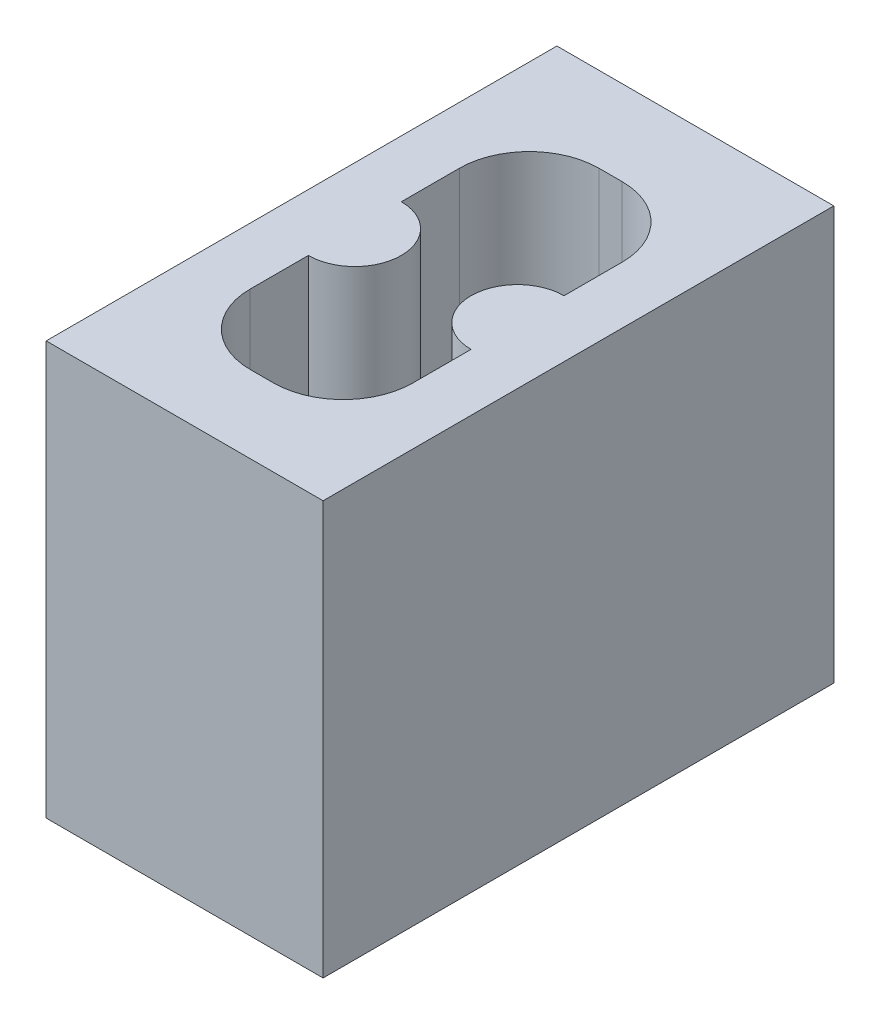
ISO-10303-21;
HEADER;
FILE_DESCRIPTION(('STEP AP214'),'2;1');
FILE_NAME('part.step','',(''),(''),'','','');
FILE_SCHEMA(('AUTOMOTIVE_DESIGN { 1 0 10303 214 1 1 1 1 }'));
ENDSEC;
DATA;
#1=APPLICATION_CONTEXT('core data for automotive mechanical design processes');
#2=APPLICATION_PROTOCOL_DEFINITION('international standard','automotive_design',2000,#1);
#3=PRODUCT_CONTEXT('',#1,'mechanical');
#4=PRODUCT('Part','Part','',(#3));
#5=PRODUCT_RELATED_PRODUCT_CATEGORY('part','',(#4));
#6=PRODUCT_DEFINITION_FORMATION('','',#4);
#7=PRODUCT_DEFINITION_CONTEXT('part definition',#1,'design');
#8=PRODUCT_DEFINITION('design','',#6,#7);
#9=PRODUCT_DEFINITION_SHAPE('','',#8);
#10=(LENGTH_UNIT() NAMED_UNIT(*) SI_UNIT(.MILLI.,.METRE.));
#11=(NAMED_UNIT(*) PLANE_ANGLE_UNIT() SI_UNIT($,.RADIAN.));
#12=(NAMED_UNIT(*) SI_UNIT($,.STERADIAN.) SOLID_ANGLE_UNIT());
#13=UNCERTAINTY_MEASURE_WITH_UNIT(LENGTH_MEASURE(1.E-05),#10,'distance_accuracy_value','');
#14=(GEOMETRIC_REPRESENTATION_CONTEXT(3) GLOBAL_UNCERTAINTY_ASSIGNED_CONTEXT((#13)) GLOBAL_UNIT_ASSIGNED_CONTEXT((#10,
#11,#12)) REPRESENTATION_CONTEXT('',''));
#15=CARTESIAN_POINT('',(0.,0.,0.));
#16=DIRECTION('',(0.,0.,1.));
#17=DIRECTION('',(1.,0.,0.));
#18=AXIS2_PLACEMENT_3D('',#15,#16,#17);
#19=CARTESIAN_POINT('',(0.509999421629871,17.79,-7.33613194140708));
#20=DIRECTION('',(0.,0.,1.));
#21=DIRECTION('',(-1.,0.,0.));
#22=AXIS2_PLACEMENT_3D('',#19,#20,#21);
#23=PLANE('',#22);
#24=DIRECTION('',(1.,0.,0.));
#25=VECTOR('',#24,1.);
#26=CARTESIAN_POINT('',(-5.78370315182375E-07,0.,-7.33613194140708));
#27=LINE('',#26,#25);
#28=CARTESIAN_POINT('',(-0.500000578370261,0.,-7.33613194140708));
#29=VERTEX_POINT('',#28);
#30=CARTESIAN_POINT('',(0.499999421629738,0.,-7.33613194140708));
#31=VERTEX_POINT('',#30);
#32=EDGE_CURVE('E190',#29,#31,#27,.T.);
#33=ORIENTED_EDGE('',*,*,#32,.T.);
#34=DIRECTION('',(0.,-1.,0.));
#35=VECTOR('',#34,1.);
#36=CARTESIAN_POINT('',(0.499999421629811,8.89000000000001,-7.33613194140708));
#37=LINE('',#36,#35);
#38=CARTESIAN_POINT('',(0.499999421629873,17.78,-7.33613194140708));
#39=VERTEX_POINT('',#38);
#40=EDGE_CURVE('E171',#39,#31,#37,.T.);
#41=ORIENTED_EDGE('',*,*,#40,.F.);
#42=DIRECTION('',(-1.,0.,0.));
#43=VECTOR('',#42,1.);
#44=CARTESIAN_POINT('',(-5.78370190824386E-07,17.78,-7.33613194140708));
#45=LINE('',#44,#43);
#46=CARTESIAN_POINT('',(-0.500000578370128,17.78,-7.33613194140708));
#47=VERTEX_POINT('',#46);
#48=EDGE_CURVE('E192',#39,#47,#45,.T.);
#49=ORIENTED_EDGE('',*,*,#48,.T.);
#50=DIRECTION('',(0.,1.,0.));
#51=VECTOR('',#50,1.);
#52=CARTESIAN_POINT('',(-0.50000057837019,8.89,-7.33613194140708));
#53=LINE('',#52,#51);
#54=EDGE_CURVE('E160',#29,#47,#53,.T.);
#55=ORIENTED_EDGE('',*,*,#54,.F.);
#56=EDGE_LOOP('',(#33,#41,#49,#55));
#57=FACE_BOUND('',#56,.T.);
#58=ADVANCED_FACE('F16',(#57),#23,.T.);
#59=CARTESIAN_POINT('',(-0.510000578370131,17.79,7.66386805859292));
#60=DIRECTION('',(0.,0.,-1.));
#61=DIRECTION('',(1.,0.,0.));
#62=AXIS2_PLACEMENT_3D('',#59,#60,#61);
#63=PLANE('',#62);
#64=DIRECTION('',(-1.,0.,0.));
#65=VECTOR('',#64,1.);
#66=CARTESIAN_POINT('',(-5.78370255442835E-07,0.,7.66386805859289));
#67=LINE('',#66,#65);
#68=CARTESIAN_POINT('',(0.499999421629808,0.,7.66386805859289));
#69=VERTEX_POINT('',#68);
#70=CARTESIAN_POINT('',(-0.500000578370266,0.,7.66386805859289));
#71=VERTEX_POINT('',#70);
#72=EDGE_CURVE('E188',#69,#71,#67,.T.);
#73=ORIENTED_EDGE('',*,*,#72,.T.);
#74=DIRECTION('',(0.,-1.,0.));
#75=VECTOR('',#74,1.);
#76=CARTESIAN_POINT('',(-0.500000578370194,8.88999999999999,7.66386805859291));
#77=LINE('',#76,#75);
#78=CARTESIAN_POINT('',(-0.500000578370133,17.78,7.66386805859292));
#79=VERTEX_POINT('',#78);
#80=EDGE_CURVE('E162',#79,#71,#77,.T.);
#81=ORIENTED_EDGE('',*,*,#80,.F.);
#82=DIRECTION('',(-1.,0.,0.));
#83=VECTOR('',#82,1.);
#84=CARTESIAN_POINT('',(0.,17.78,7.66386805859292));
#85=LINE('',#84,#83);
#86=CARTESIAN_POINT('',(0.499999421629871,17.78,7.66386805859292));
#87=VERTEX_POINT('',#86);
#88=EDGE_CURVE('E221',#87,#79,#85,.T.);
#89=ORIENTED_EDGE('',*,*,#88,.F.);
#90=DIRECTION('',(0.,1.,0.));
#91=VECTOR('',#90,1.);
#92=CARTESIAN_POINT('',(0.499999421629808,8.89,7.66386805859291));
#93=LINE('',#92,#91);
#94=EDGE_CURVE('E159',#69,#87,#93,.T.);
#95=ORIENTED_EDGE('',*,*,#94,.F.);
#96=EDGE_LOOP('',(#73,#81,#89,#95));
#97=FACE_BOUND('',#96,.T.);
#98=ADVANCED_FACE('F264',(#97),#63,.T.);
#99=CARTESIAN_POINT('',(5.96630000000001,-0.01,-10.9855));
#100=DIRECTION('',(0.,0.,-1.));
#101=DIRECTION('',(-1.,0.,0.));
#102=AXIS2_PLACEMENT_3D('',#99,#100,#101);
#103=PLANE('',#102);
#104=DIRECTION('',(-1.,0.,0.));
#105=VECTOR('',#104,1.);
#106=CARTESIAN_POINT('',(0.,17.78,-10.9855));
#107=LINE('',#106,#105);
#108=CARTESIAN_POINT('',(5.9563,17.78,-10.9855));
#109=VERTEX_POINT('',#108);
#110=CARTESIAN_POINT('',(-5.9563,17.78,-10.9855));
#111=VERTEX_POINT('',#110);
#112=EDGE_CURVE('E150',#109,#111,#107,.T.);
#113=ORIENTED_EDGE('',*,*,#112,.F.);
#114=DIRECTION('',(0.,1.,0.));
#115=VECTOR('',#114,1.);
#116=CARTESIAN_POINT('',(5.9563,8.88999999999999,-10.9855));
#117=LINE('',#116,#115);
#118=CARTESIAN_POINT('',(5.9563,0.,-10.9855));
#119=VERTEX_POINT('',#118);
#120=EDGE_CURVE('E185',#119,#109,#117,.T.);
#121=ORIENTED_EDGE('',*,*,#120,.F.);
#122=DIRECTION('',(1.,0.,0.));
#123=VECTOR('',#122,1.);
#124=CARTESIAN_POINT('',(0.,0.,-10.9855));
#125=LINE('',#124,#123);
#126=CARTESIAN_POINT('',(-5.9563,0.,-10.9855));
#127=VERTEX_POINT('',#126);
#128=EDGE_CURVE('E165',#127,#119,#125,.T.);
#129=ORIENTED_EDGE('',*,*,#128,.F.);
#130=DIRECTION('',(0.,-1.,0.));
#131=VECTOR('',#130,1.);
#132=CARTESIAN_POINT('',(-5.9563,8.88999999999999,-10.9855));
#133=LINE('',#132,#131);
#134=EDGE_CURVE('E122',#111,#127,#133,.T.);
#135=ORIENTED_EDGE('',*,*,#134,.F.);
#136=EDGE_LOOP('',(#113,#121,#129,#135));
#137=FACE_BOUND('',#136,.T.);
#138=ADVANCED_FACE('F409',(#137),#103,.T.);
#139=CARTESIAN_POINT('',(5.9563,-0.01,10.9955));
#140=DIRECTION('',(1.,0.,0.));
#141=DIRECTION('',(0.,0.,-1.));
#142=AXIS2_PLACEMENT_3D('',#139,#140,#141);
#143=PLANE('',#142);
#144=DIRECTION('',(0.,0.,-1.));
#145=VECTOR('',#144,1.);
#146=CARTESIAN_POINT('',(5.9563,17.78,0.));
#147=LINE('',#146,#145);
#148=CARTESIAN_POINT('',(5.9563,17.78,10.9855));
#149=VERTEX_POINT('',#148);
#150=EDGE_CURVE('E138',#149,#109,#147,.T.);
#151=ORIENTED_EDGE('',*,*,#150,.F.);
#152=DIRECTION('',(0.,1.,0.));
#153=VECTOR('',#152,1.);
#154=CARTESIAN_POINT('',(5.9563,8.88999999999999,10.9855));
#155=LINE('',#154,#153);
#156=CARTESIAN_POINT('',(5.9563,0.,10.9855));
#157=VERTEX_POINT('',#156);
#158=EDGE_CURVE('E182',#157,#149,#155,.T.);
#159=ORIENTED_EDGE('',*,*,#158,.F.);
#160=DIRECTION('',(0.,0.,1.));
#161=VECTOR('',#160,1.);
#162=CARTESIAN_POINT('',(5.9563,0.,0.));
#163=LINE('',#162,#161);
#164=EDGE_CURVE('E236',#119,#157,#163,.T.);
#165=ORIENTED_EDGE('',*,*,#164,.F.);
#166=ORIENTED_EDGE('',*,*,#120,.T.);
#167=EDGE_LOOP('',(#151,#159,#165,#166));
#168=FACE_BOUND('',#167,.T.);
#169=ADVANCED_FACE('F400',(#168),#143,.T.);
#170=CARTESIAN_POINT('',(-5.96630000000001,-0.01,10.9855));
#171=DIRECTION('',(0.,0.,1.));
#172=DIRECTION('',(1.,0.,0.));
#173=AXIS2_PLACEMENT_3D('',#170,#171,#172);
#174=PLANE('',#173);
#175=DIRECTION('',(1.,0.,0.));
#176=VECTOR('',#175,1.);
#177=CARTESIAN_POINT('',(0.,17.78,10.9855));
#178=LINE('',#177,#176);
#179=CARTESIAN_POINT('',(-5.9563,17.78,10.9855));
#180=VERTEX_POINT('',#179);
#181=EDGE_CURVE('E141',#180,#149,#178,.T.);
#182=ORIENTED_EDGE('',*,*,#181,.F.);
#183=DIRECTION('',(0.,1.,0.));
#184=VECTOR('',#183,1.);
#185=CARTESIAN_POINT('',(-5.9563,8.88999999999999,10.9855));
#186=LINE('',#185,#184);
#187=CARTESIAN_POINT('',(-5.9563,0.,10.9855));
#188=VERTEX_POINT('',#187);
#189=EDGE_CURVE('E179',#188,#180,#186,.T.);
#190=ORIENTED_EDGE('',*,*,#189,.F.);
#191=DIRECTION('',(-1.,0.,0.));
#192=VECTOR('',#191,1.);
#193=CARTESIAN_POINT('',(0.,0.,10.9855));
#194=LINE('',#193,#192);
#195=EDGE_CURVE('E239',#157,#188,#194,.T.);
#196=ORIENTED_EDGE('',*,*,#195,.F.);
#197=ORIENTED_EDGE('',*,*,#158,.T.);
#198=EDGE_LOOP('',(#182,#190,#196,#197));
#199=FACE_BOUND('',#198,.T.);
#200=ADVANCED_FACE('F391',(#199),#174,.T.);
#201=CARTESIAN_POINT('',(-5.9563,-0.01,-10.9955));
#202=DIRECTION('',(-1.,0.,0.));
#203=DIRECTION('',(0.,0.,1.));
#204=AXIS2_PLACEMENT_3D('',#201,#202,#203);
#205=PLANE('',#204);
#206=DIRECTION('',(0.,0.,1.));
#207=VECTOR('',#206,1.);
#208=CARTESIAN_POINT('',(-5.9563,17.78,0.));
#209=LINE('',#208,#207);
#210=EDGE_CURVE('E147',#111,#180,#209,.T.);
#211=ORIENTED_EDGE('',*,*,#210,.F.);
#212=ORIENTED_EDGE('',*,*,#134,.T.);
#213=DIRECTION('',(0.,0.,-1.));
#214=VECTOR('',#213,1.);
#215=CARTESIAN_POINT('',(-5.9563,0.,0.));
#216=LINE('',#215,#214);
#217=EDGE_CURVE('E242',#188,#127,#216,.T.);
#218=ORIENTED_EDGE('',*,*,#217,.F.);
#219=ORIENTED_EDGE('',*,*,#189,.T.);
#220=EDGE_LOOP('',(#211,#212,#218,#219));
#221=FACE_BOUND('',#220,.T.);
#222=ADVANCED_FACE('F383',(#221),#205,.T.);
#223=CARTESIAN_POINT('',(3.49999942162988,17.79,4.67386805859292));
#224=DIRECTION('',(-1.,0.,0.));
#225=DIRECTION('',(0.,0.,-1.));
#226=AXIS2_PLACEMENT_3D('',#223,#224,#225);
#227=PLANE('',#226);
#228=DIRECTION('',(0.,0.,-1.));
#229=VECTOR('',#228,1.);
#230=CARTESIAN_POINT('',(3.49999942162975,0.,0.));
#231=LINE('',#230,#229);
#232=CARTESIAN_POINT('',(3.49999942162975,0.,4.66386805859292));
#233=VERTEX_POINT('',#232);
#234=CARTESIAN_POINT('',(3.49999942162975,0.,2.16386805859291));
#235=VERTEX_POINT('',#234);
#236=EDGE_CURVE('E213',#233,#235,#231,.T.);
#237=ORIENTED_EDGE('',*,*,#236,.F.);
#238=DIRECTION('',(0.,-1.,0.));
#239=VECTOR('',#238,1.);
#240=CARTESIAN_POINT('',(3.49999942162982,8.88999999999999,4.66386805859292));
#241=LINE('',#240,#239);
#242=CARTESIAN_POINT('',(3.49999942162988,17.78,4.66386805859293));
#243=VERTEX_POINT('',#242);
#244=EDGE_CURVE('E128',#243,#233,#241,.T.);
#245=ORIENTED_EDGE('',*,*,#244,.F.);
#246=DIRECTION('',(0.,0.,1.));
#247=VECTOR('',#246,1.);
#248=CARTESIAN_POINT('',(3.49999942162988,17.78,0.));
#249=LINE('',#248,#247);
#250=CARTESIAN_POINT('',(3.49999942162988,17.78,2.16386805859293));
#251=VERTEX_POINT('',#250);
#252=EDGE_CURVE('E125',#251,#243,#249,.T.);
#253=ORIENTED_EDGE('',*,*,#252,.F.);
#254=DIRECTION('',(0.,1.,0.));
#255=VECTOR('',#254,1.);
#256=CARTESIAN_POINT('',(3.49999942162982,8.88999999999998,2.16386805859292));
#257=LINE('',#256,#255);
#258=EDGE_CURVE('E113',#235,#251,#257,.T.);
#259=ORIENTED_EDGE('',*,*,#258,.F.);
#260=EDGE_LOOP('',(#237,#245,#253,#259));
#261=FACE_BOUND('',#260,.T.);
#262=ADVANCED_FACE('F126',(#261),#227,.T.);
#263=CARTESIAN_POINT('',(3.49999942162976,0.,0.163868058592909));
#264=DIRECTION('',(0.,1.,0.));
#265=DIRECTION('',(-1.,0.,0.));
#266=AXIS2_PLACEMENT_3D('',#263,#264,#265);
#267=CYLINDRICAL_SURFACE('',#266,2.00000000000001);
#268=CARTESIAN_POINT('',(3.49999942162976,0.,0.163868058592909));
#269=DIRECTION('',(0.,1.,0.));
#270=DIRECTION('',(-1.,0.,0.));
#271=AXIS2_PLACEMENT_3D('',#268,#269,#270);
#272=CIRCLE('',#271,2.00000000000001);
#273=CARTESIAN_POINT('',(3.49999942162975,0.,-1.8361319414071));
#274=VERTEX_POINT('',#273);
#275=EDGE_CURVE('E119',#235,#274,#272,.F.);
#276=ORIENTED_EDGE('',*,*,#275,.F.);
#277=ORIENTED_EDGE('',*,*,#258,.T.);
#278=CARTESIAN_POINT('',(3.49999942162988,17.78,0.163868058592929));
#279=DIRECTION('',(0.,1.,0.));
#280=DIRECTION('',(-1.,0.,0.));
#281=AXIS2_PLACEMENT_3D('',#278,#279,#280);
#282=CIRCLE('',#281,2.00000000000001);
#283=CARTESIAN_POINT('',(3.49999942162988,17.78,-1.83613194140707));
#284=VERTEX_POINT('',#283);
#285=EDGE_CURVE('E20',#284,#251,#282,.T.);
#286=ORIENTED_EDGE('',*,*,#285,.F.);
#287=DIRECTION('',(0.,1.,0.));
#288=VECTOR('',#287,1.);
#289=CARTESIAN_POINT('',(3.49999942162982,8.88999999999999,-1.83613194140708));
#290=LINE('',#289,#288);
#291=EDGE_CURVE('E108',#274,#284,#290,.T.);
#292=ORIENTED_EDGE('',*,*,#291,.F.);
#293=EDGE_LOOP('',(#276,#277,#286,#292));
#294=FACE_BOUND('',#293,.T.);
#295=ADVANCED_FACE('F115',(#294),#267,.T.);
#296=CARTESIAN_POINT('',(3.49999942162988,17.79,-1.82613194140707));
#297=DIRECTION('',(-1.,0.,0.));
#298=DIRECTION('',(0.,0.,-1.));
#299=AXIS2_PLACEMENT_3D('',#296,#297,#298);
#300=PLANE('',#299);
#301=DIRECTION('',(0.,0.,-1.));
#302=VECTOR('',#301,1.);
#303=CARTESIAN_POINT('',(3.49999942162975,0.,0.));
#304=LINE('',#303,#302);
#305=CARTESIAN_POINT('',(3.49999942162975,0.,-4.33613194140708));
#306=VERTEX_POINT('',#305);
#307=EDGE_CURVE('E211',#274,#306,#304,.T.);
#308=ORIENTED_EDGE('',*,*,#307,.F.);
#309=ORIENTED_EDGE('',*,*,#291,.T.);
#310=DIRECTION('',(0.,0.,1.));
#311=VECTOR('',#310,1.);
#312=CARTESIAN_POINT('',(3.49999942162988,17.78,0.));
#313=LINE('',#312,#311);
#314=CARTESIAN_POINT('',(3.49999942162988,17.78,-4.33613194140707));
#315=VERTEX_POINT('',#314);
#316=EDGE_CURVE('E137',#315,#284,#313,.T.);
#317=ORIENTED_EDGE('',*,*,#316,.F.);
#318=DIRECTION('',(0.,1.,0.));
#319=VECTOR('',#318,1.);
#320=CARTESIAN_POINT('',(3.49999942162982,8.88999999999999,-4.33613194140708));
#321=LINE('',#320,#319);
#322=EDGE_CURVE('E170',#306,#315,#321,.T.);
#323=ORIENTED_EDGE('',*,*,#322,.F.);
#324=EDGE_LOOP('',(#308,#309,#317,#323));
#325=FACE_BOUND('',#324,.T.);
#326=ADVANCED_FACE('F269',(#325),#300,.T.);
#327=CARTESIAN_POINT('',(0.499999421629872,17.78,-4.33613194140706));
#328=DIRECTION('',(0.,-1.,0.));
#329=DIRECTION('',(1.,0.,0.));
#330=AXIS2_PLACEMENT_3D('',#327,#328,#329);
#331=CYLINDRICAL_SURFACE('',#330,3.00000000000001);
#332=CARTESIAN_POINT('',(0.499999421629728,0.,-4.33613194140706));
#333=DIRECTION('',(0.,-1.,0.));
#334=DIRECTION('',(1.,0.,0.));
#335=AXIS2_PLACEMENT_3D('',#332,#333,#334);
#336=CIRCLE('',#335,3.00000000000001);
#337=EDGE_CURVE('E208',#306,#31,#336,.F.);
#338=ORIENTED_EDGE('',*,*,#337,.F.);
#339=ORIENTED_EDGE('',*,*,#322,.T.);
#340=CARTESIAN_POINT('',(0.499999421629872,17.78,-4.33613194140706));
#341=DIRECTION('',(0.,-1.,0.));
#342=DIRECTION('',(1.,0.,0.));
#343=AXIS2_PLACEMENT_3D('',#340,#341,#342);
#344=CIRCLE('',#343,3.00000000000001);
#345=EDGE_CURVE('E216',#39,#315,#344,.T.);
#346=ORIENTED_EDGE('',*,*,#345,.F.);
#347=ORIENTED_EDGE('',*,*,#40,.T.);
#348=EDGE_LOOP('',(#338,#339,#346,#347));
#349=FACE_BOUND('',#348,.T.);
#350=ADVANCED_FACE('F272',(#349),#331,.F.);
#351=CARTESIAN_POINT('',(-0.500000578370127,17.78,-4.33613194140706));
#352=DIRECTION('',(0.,-1.,0.));
#353=DIRECTION('',(1.,0.,0.));
#354=AXIS2_PLACEMENT_3D('',#351,#352,#353);
#355=CYLINDRICAL_SURFACE('',#354,3.00000000000001);
#356=CARTESIAN_POINT('',(-0.500000578370271,0.,-4.33613194140706));
#357=DIRECTION('',(0.,-1.,0.));
#358=DIRECTION('',(1.,0.,0.));
#359=AXIS2_PLACEMENT_3D('',#356,#357,#358);
#360=CIRCLE('',#359,3.00000000000001);
#361=CARTESIAN_POINT('',(-3.50000057837026,0.,-4.33613194140708));
#362=VERTEX_POINT('',#361);
#363=EDGE_CURVE('E205',#29,#362,#360,.F.);
#364=ORIENTED_EDGE('',*,*,#363,.F.);
#365=ORIENTED_EDGE('',*,*,#54,.T.);
#366=CARTESIAN_POINT('',(-0.500000578370127,17.78,-4.33613194140706));
#367=DIRECTION('',(0.,-1.,0.));
#368=DIRECTION('',(1.,0.,0.));
#369=AXIS2_PLACEMENT_3D('',#366,#367,#368);
#370=CIRCLE('',#369,3.00000000000001);
#371=CARTESIAN_POINT('',(-3.50000057837014,17.78,-4.33613194140706));
#372=VERTEX_POINT('',#371);
#373=EDGE_CURVE('E218',#372,#47,#370,.T.);
#374=ORIENTED_EDGE('',*,*,#373,.F.);
#375=DIRECTION('',(0.,1.,0.));
#376=VECTOR('',#375,1.);
#377=CARTESIAN_POINT('',(-3.5000005783702,8.88999999999999,-4.33613194140708));
#378=LINE('',#377,#376);
#379=EDGE_CURVE('E153',#362,#372,#378,.T.);
#380=ORIENTED_EDGE('',*,*,#379,.F.);
#381=EDGE_LOOP('',(#364,#365,#374,#380));
#382=FACE_BOUND('',#381,.T.);
#383=ADVANCED_FACE('F278',(#382),#355,.F.);
#384=CARTESIAN_POINT('',(0.499999421629871,17.78,4.66386805859293));
#385=DIRECTION('',(0.,-1.,0.));
#386=DIRECTION('',(0.,0.,-1.));
#387=AXIS2_PLACEMENT_3D('',#384,#385,#386);
#388=CYLINDRICAL_SURFACE('',#387,3.);
#389=CARTESIAN_POINT('',(0.499999421629871,0.,4.66386805859293));
#390=DIRECTION('',(0.,-1.,0.));
#391=DIRECTION('',(0.,0.,-1.));
#392=AXIS2_PLACEMENT_3D('',#389,#390,#391);
#393=CIRCLE('',#392,3.);
#394=EDGE_CURVE('E198',#69,#233,#393,.F.);
#395=ORIENTED_EDGE('',*,*,#394,.F.);
#396=ORIENTED_EDGE('',*,*,#94,.T.);
#397=CARTESIAN_POINT('',(0.499999421629871,17.78,4.66386805859293));
#398=DIRECTION('',(0.,-1.,0.));
#399=DIRECTION('',(0.,0.,-1.));
#400=AXIS2_PLACEMENT_3D('',#397,#398,#399);
#401=CIRCLE('',#400,3.);
#402=EDGE_CURVE('E132',#243,#87,#401,.T.);
#403=ORIENTED_EDGE('',*,*,#402,.F.);
#404=ORIENTED_EDGE('',*,*,#244,.T.);
#405=EDGE_LOOP('',(#395,#396,#403,#404));
#406=FACE_BOUND('',#405,.T.);
#407=ADVANCED_FACE('F267',(#406),#388,.F.);
#408=CARTESIAN_POINT('',(-3.50000057837014,17.79,-4.34613194140707));
#409=DIRECTION('',(1.,0.,0.));
#410=DIRECTION('',(0.,0.,1.));
#411=AXIS2_PLACEMENT_3D('',#408,#409,#410);
#412=PLANE('',#411);
#413=DIRECTION('',(0.,0.,1.));
#414=VECTOR('',#413,1.);
#415=CARTESIAN_POINT('',(-3.50000057837026,0.,0.));
#416=LINE('',#415,#414);
#417=CARTESIAN_POINT('',(-3.50000057837026,0.,-1.8361319414071));
#418=VERTEX_POINT('',#417);
#419=EDGE_CURVE('E204',#362,#418,#416,.T.);
#420=ORIENTED_EDGE('',*,*,#419,.F.);
#421=ORIENTED_EDGE('',*,*,#379,.T.);
#422=DIRECTION('',(0.,0.,-1.));
#423=VECTOR('',#422,1.);
#424=CARTESIAN_POINT('',(-3.50000057837014,17.78,0.));
#425=LINE('',#424,#423);
#426=CARTESIAN_POINT('',(-3.50000057837014,17.78,-1.83613194140708));
#427=VERTEX_POINT('',#426);
#428=EDGE_CURVE('E220',#427,#372,#425,.T.);
#429=ORIENTED_EDGE('',*,*,#428,.F.);
#430=DIRECTION('',(0.,1.,0.));
#431=VECTOR('',#430,1.);
#432=CARTESIAN_POINT('',(-3.5000005783702,8.89000000000001,-1.83613194140708));
#433=LINE('',#432,#431);
#434=EDGE_CURVE('E154',#418,#427,#433,.T.);
#435=ORIENTED_EDGE('',*,*,#434,.F.);
#436=EDGE_LOOP('',(#420,#421,#429,#435));
#437=FACE_BOUND('',#436,.T.);
#438=ADVANCED_FACE('F254',(#437),#412,.T.);
#439=CARTESIAN_POINT('',(-5.96630000000001,17.78,-10.9955));
#440=DIRECTION('',(0.,1.,0.));
#441=DIRECTION('',(0.,0.,1.));
#442=AXIS2_PLACEMENT_3D('',#439,#440,#441);
#443=PLANE('',#442);
#444=ORIENTED_EDGE('',*,*,#48,.F.);
#445=ORIENTED_EDGE('',*,*,#345,.T.);
#446=ORIENTED_EDGE('',*,*,#316,.T.);
#447=ORIENTED_EDGE('',*,*,#285,.T.);
#448=ORIENTED_EDGE('',*,*,#252,.T.);
#449=ORIENTED_EDGE('',*,*,#402,.T.);
#450=ORIENTED_EDGE('',*,*,#88,.T.);
#451=CARTESIAN_POINT('',(-0.500000578370133,17.78,4.66386805859293));
#452=DIRECTION('',(0.,-1.,0.));
#453=DIRECTION('',(1.,0.,0.));
#454=AXIS2_PLACEMENT_3D('',#451,#452,#453);
#455=CIRCLE('',#454,3.);
#456=CARTESIAN_POINT('',(-3.50000057837014,17.78,4.66386805859293));
#457=VERTEX_POINT('',#456);
#458=EDGE_CURVE('E166',#457,#79,#455,.F.);
#459=ORIENTED_EDGE('',*,*,#458,.F.);
#460=DIRECTION('',(0.,0.,1.));
#461=VECTOR('',#460,1.);
#462=CARTESIAN_POINT('',(-3.50000057837014,17.78,3.41386805859292));
#463=LINE('',#462,#461);
#464=CARTESIAN_POINT('',(-3.50000057837014,17.78,2.16386805859293));
#465=VERTEX_POINT('',#464);
#466=EDGE_CURVE('E157',#465,#457,#463,.T.);
#467=ORIENTED_EDGE('',*,*,#466,.F.);
#468=CARTESIAN_POINT('',(-3.50000057837014,17.78,0.163868058592925));
#469=DIRECTION('',(0.,1.,0.));
#470=DIRECTION('',(-1.,0.,0.));
#471=AXIS2_PLACEMENT_3D('',#468,#469,#470);
#472=CIRCLE('',#471,2.);
#473=EDGE_CURVE('E195',#427,#465,#472,.F.);
#474=ORIENTED_EDGE('',*,*,#473,.F.);
#475=ORIENTED_EDGE('',*,*,#428,.T.);
#476=ORIENTED_EDGE('',*,*,#373,.T.);
#477=EDGE_LOOP('',(#444,#445,#446,#447,#448,#449,#450,#459,#467,#474,#475,#476));
#478=FACE_BOUND('',#477,.T.);
#479=ORIENTED_EDGE('',*,*,#181,.T.);
#480=ORIENTED_EDGE('',*,*,#150,.T.);
#481=ORIENTED_EDGE('',*,*,#112,.T.);
#482=ORIENTED_EDGE('',*,*,#210,.T.);
#483=EDGE_LOOP('',(#479,#480,#481,#482));
#484=FACE_BOUND('',#483,.T.);
#485=ADVANCED_FACE('F134',(#478,#484),#443,.T.);
#486=CARTESIAN_POINT('',(-0.500000578370133,17.78,4.66386805859293));
#487=DIRECTION('',(0.,-1.,0.));
#488=DIRECTION('',(1.,0.,0.));
#489=AXIS2_PLACEMENT_3D('',#486,#487,#488);
#490=CYLINDRICAL_SURFACE('',#489,3.);
#491=CARTESIAN_POINT('',(-0.500000578370277,0.,4.66386805859293));
#492=DIRECTION('',(0.,-1.,0.));
#493=DIRECTION('',(1.,0.,0.));
#494=AXIS2_PLACEMENT_3D('',#491,#492,#493);
#495=CIRCLE('',#494,3.);
#496=CARTESIAN_POINT('',(-3.50000057837027,0.,4.66386805859293));
#497=VERTEX_POINT('',#496);
#498=EDGE_CURVE('E201',#497,#71,#495,.F.);
#499=ORIENTED_EDGE('',*,*,#498,.F.);
#500=DIRECTION('',(0.,-1.,0.));
#501=VECTOR('',#500,1.);
#502=CARTESIAN_POINT('',(-3.5000005783702,8.88999999999999,4.66386805859293));
#503=LINE('',#502,#501);
#504=EDGE_CURVE('E228',#457,#497,#503,.T.);
#505=ORIENTED_EDGE('',*,*,#504,.F.);
#506=ORIENTED_EDGE('',*,*,#458,.T.);
#507=ORIENTED_EDGE('',*,*,#80,.T.);
#508=EDGE_LOOP('',(#499,#505,#506,#507));
#509=FACE_BOUND('',#508,.T.);
#510=ADVANCED_FACE('F262',(#509),#490,.F.);
#511=CARTESIAN_POINT('',(5.96630000000001,0.,10.9955));
#512=DIRECTION('',(0.,-1.,0.));
#513=DIRECTION('',(-1.,0.,0.));
#514=AXIS2_PLACEMENT_3D('',#511,#512,#513);
#515=PLANE('',#514);
#516=ORIENTED_EDGE('',*,*,#72,.F.);
#517=ORIENTED_EDGE('',*,*,#394,.T.);
#518=ORIENTED_EDGE('',*,*,#236,.T.);
#519=ORIENTED_EDGE('',*,*,#275,.T.);
#520=ORIENTED_EDGE('',*,*,#307,.T.);
#521=ORIENTED_EDGE('',*,*,#337,.T.);
#522=ORIENTED_EDGE('',*,*,#32,.F.);
#523=ORIENTED_EDGE('',*,*,#363,.T.);
#524=ORIENTED_EDGE('',*,*,#419,.T.);
#525=CARTESIAN_POINT('',(-3.50000057837027,0.,0.163868058592906));
#526=DIRECTION('',(0.,1.,0.));
#527=DIRECTION('',(-1.,0.,0.));
#528=AXIS2_PLACEMENT_3D('',#525,#526,#527);
#529=CIRCLE('',#528,2.);
#530=CARTESIAN_POINT('',(-3.50000057837027,0.,2.16386805859291));
#531=VERTEX_POINT('',#530);
#532=EDGE_CURVE('E35',#531,#418,#529,.T.);
#533=ORIENTED_EDGE('',*,*,#532,.F.);
#534=DIRECTION('',(0.,0.,-1.));
#535=VECTOR('',#534,1.);
#536=CARTESIAN_POINT('',(-3.50000057837027,0.,3.41386805859291));
#537=LINE('',#536,#535);
#538=EDGE_CURVE('E26',#497,#531,#537,.T.);
#539=ORIENTED_EDGE('',*,*,#538,.F.);
#540=ORIENTED_EDGE('',*,*,#498,.T.);
#541=EDGE_LOOP('',(#516,#517,#518,#519,#520,#521,#522,#523,#524,#533,#539,#540));
#542=FACE_BOUND('',#541,.T.);
#543=ORIENTED_EDGE('',*,*,#195,.T.);
#544=ORIENTED_EDGE('',*,*,#217,.T.);
#545=ORIENTED_EDGE('',*,*,#128,.T.);
#546=ORIENTED_EDGE('',*,*,#164,.T.);
#547=EDGE_LOOP('',(#543,#544,#545,#546));
#548=FACE_BOUND('',#547,.T.);
#549=ADVANCED_FACE('F250',(#542,#548),#515,.T.);
#550=CARTESIAN_POINT('',(-3.50000057837027,0.,0.163868058592906));
#551=DIRECTION('',(0.,1.,0.));
#552=DIRECTION('',(-1.,0.,0.));
#553=AXIS2_PLACEMENT_3D('',#550,#551,#552);
#554=CYLINDRICAL_SURFACE('',#553,2.);
#555=ORIENTED_EDGE('',*,*,#532,.T.);
#556=ORIENTED_EDGE('',*,*,#434,.T.);
#557=ORIENTED_EDGE('',*,*,#473,.T.);
#558=DIRECTION('',(0.,1.,0.));
#559=VECTOR('',#558,1.);
#560=CARTESIAN_POINT('',(-3.5000005783702,8.88999999999999,2.16386805859292));
#561=LINE('',#560,#559);
#562=EDGE_CURVE('E10',#531,#465,#561,.T.);
#563=ORIENTED_EDGE('',*,*,#562,.F.);
#564=EDGE_LOOP('',(#555,#556,#557,#563));
#565=FACE_BOUND('',#564,.T.);
#566=ADVANCED_FACE('F257',(#565),#554,.T.);
#567=CARTESIAN_POINT('',(-3.50000057837014,17.79,2.15386805859293));
#568=DIRECTION('',(1.,0.,0.));
#569=DIRECTION('',(0.,0.,1.));
#570=AXIS2_PLACEMENT_3D('',#567,#568,#569);
#571=PLANE('',#570);
#572=ORIENTED_EDGE('',*,*,#538,.T.);
#573=ORIENTED_EDGE('',*,*,#562,.T.);
#574=ORIENTED_EDGE('',*,*,#466,.T.);
#575=ORIENTED_EDGE('',*,*,#504,.T.);
#576=EDGE_LOOP('',(#572,#573,#574,#575));
#577=FACE_BOUND('',#576,.T.);
#578=ADVANCED_FACE('F18',(#577),#571,.T.);
#579=CLOSED_SHELL('',(#58,#98,#138,#169,#200,#222,#262,#295,#326,#350,#383,#407,#438,#485,#510,
#549,#566,#578));
#580=MANIFOLD_SOLID_BREP('B1',#579);
#581=ADVANCED_BREP_SHAPE_REPRESENTATION('',(#18,#580),#14);
#582=SHAPE_DEFINITION_REPRESENTATION(#9,#581);
ENDSEC;
END-ISO-10303-21;
